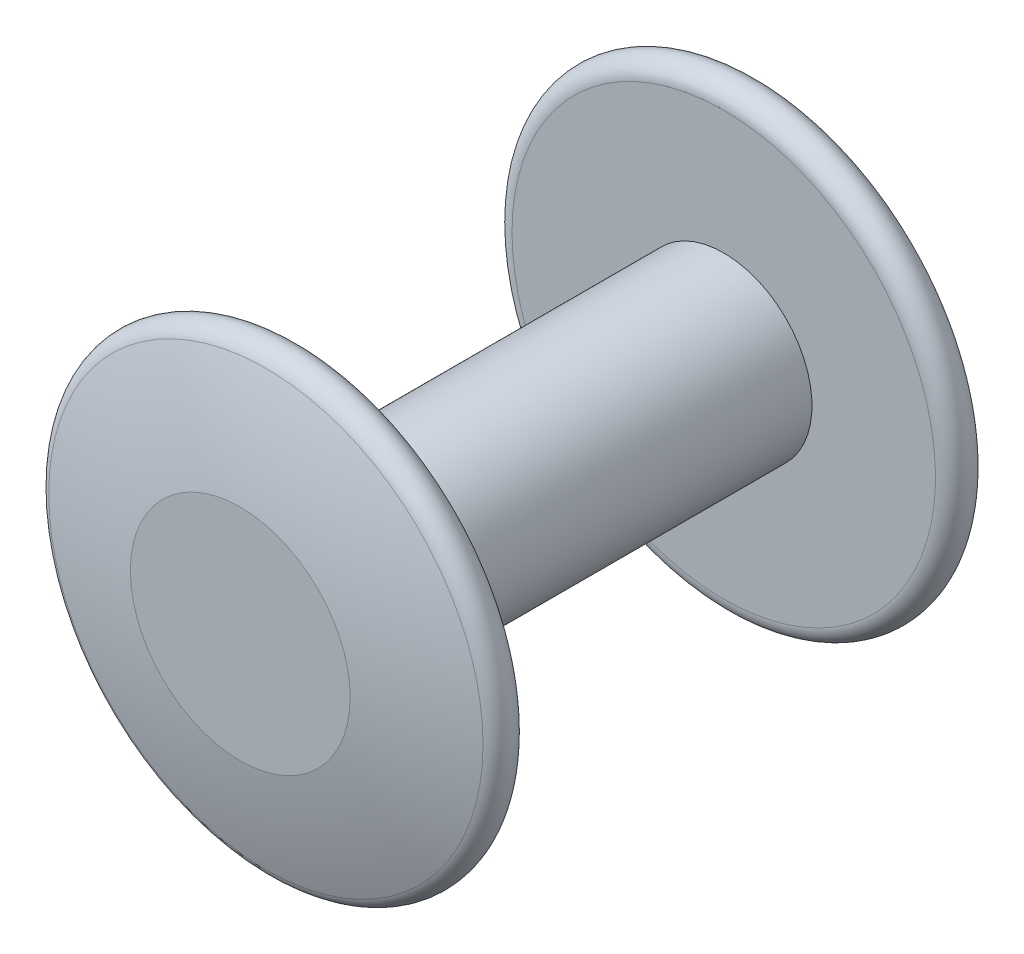
ISO-10303-21;
HEADER;
FILE_DESCRIPTION(('STEP AP214'),'2;1');
FILE_NAME('part.step','',(''),(''),'','','');
FILE_SCHEMA(('AUTOMOTIVE_DESIGN { 1 0 10303 214 1 1 1 1 }'));
ENDSEC;
DATA;
#1=APPLICATION_CONTEXT('core data for automotive mechanical design processes');
#2=APPLICATION_PROTOCOL_DEFINITION('international standard','automotive_design',2000,#1);
#3=PRODUCT_CONTEXT('',#1,'mechanical');
#4=PRODUCT('Part','Part','',(#3));
#5=PRODUCT_RELATED_PRODUCT_CATEGORY('part','',(#4));
#6=PRODUCT_DEFINITION_FORMATION('','',#4);
#7=PRODUCT_DEFINITION_CONTEXT('part definition',#1,'design');
#8=PRODUCT_DEFINITION('design','',#6,#7);
#9=PRODUCT_DEFINITION_SHAPE('','',#8);
#10=(LENGTH_UNIT() NAMED_UNIT(*) SI_UNIT(.MILLI.,.METRE.));
#11=(NAMED_UNIT(*) PLANE_ANGLE_UNIT() SI_UNIT($,.RADIAN.));
#12=(NAMED_UNIT(*) SI_UNIT($,.STERADIAN.) SOLID_ANGLE_UNIT());
#13=UNCERTAINTY_MEASURE_WITH_UNIT(LENGTH_MEASURE(1.E-05),#10,'distance_accuracy_value','');
#14=(GEOMETRIC_REPRESENTATION_CONTEXT(3) GLOBAL_UNCERTAINTY_ASSIGNED_CONTEXT((#13)) GLOBAL_UNIT_ASSIGNED_CONTEXT((#10,
#11,#12)) REPRESENTATION_CONTEXT('',''));
#15=CARTESIAN_POINT('',(0.,0.,0.));
#16=DIRECTION('',(0.,0.,1.));
#17=DIRECTION('',(1.,0.,0.));
#18=AXIS2_PLACEMENT_3D('',#15,#16,#17);
#19=CARTESIAN_POINT('',(0.,0.,-12.0539753152795));
#20=DIRECTION('',(0.,0.,-1.));
#21=DIRECTION('',(1.,0.,0.));
#22=AXIS2_PLACEMENT_3D('',#19,#20,#21);
#23=SPHERICAL_SURFACE('',#22,20.);
#24=CARTESIAN_POINT('',(0.,0.,7.70196512603628));
#25=DIRECTION('',(0.,0.,-1.));
#26=DIRECTION('',(-1.,0.,0.));
#27=AXIS2_PLACEMENT_3D('',#24,#25,#26);
#28=CIRCLE('',#27,3.11493455455891);
#29=CARTESIAN_POINT('',(3.11493455455889,0.,7.70196512603628));
#30=VERTEX_POINT('',#29);
#31=EDGE_CURVE('E10',#30,#30,#28,.T.);
#32=CARTESIAN_POINT('',(0.,0.,6.97574295680203));
#33=DIRECTION('',(0.,0.,-1.));
#34=DIRECTION('',(-1.,0.,0.));
#35=AXIS2_PLACEMENT_3D('',#32,#33,#34);
#36=CIRCLE('',#35,6.15384615384618);
#37=CARTESIAN_POINT('',(6.15384615384621,0.,6.97574295680203));
#38=VERTEX_POINT('',#37);
#39=EDGE_CURVE('E59',#38,#38,#36,.T.);
#40=CARTESIAN_POINT('',(3.11493455455889,0.,7.70196512603628));
#41=CARTESIAN_POINT('',(3.14711685014083,0.,7.69689091905556));
#42=CARTESIAN_POINT('',(3.17928674673247,0.,7.69173807363344));
#43=CARTESIAN_POINT('',(3.24360097411827,0.,7.68127523192936));
#44=CARTESIAN_POINT('',(3.27574530491243,0.,7.67596523564741));
#45=CARTESIAN_POINT('',(3.34000763288644,0.,7.66518821824666));
#46=CARTESIAN_POINT('',(3.37212563006628,0.,7.65972119712786));
#47=CARTESIAN_POINT('',(3.43633452378729,0.,7.64863026083222));
#48=CARTESIAN_POINT('',(3.46842542032847,0.,7.64300634565538));
#49=CARTESIAN_POINT('',(3.53257934635121,0.,7.63160175550001));
#50=CARTESIAN_POINT('',(3.56464237583278,0.,7.62582108052149));
#51=CARTESIAN_POINT('',(3.62873980199265,0.,7.61410310883513));
#52=CARTESIAN_POINT('',(3.66077419867094,0.,7.60816581212729));
#53=CARTESIAN_POINT('',(3.72481359416128,0.,7.59613473877587));
#54=CARTESIAN_POINT('',(3.75681859297333,0.,7.59004096213229));
#55=CARTESIAN_POINT('',(3.82079842837111,0.,7.57769707444524));
#56=CARTESIAN_POINT('',(3.85277326495685,0.,7.57144696340178));
#57=CARTESIAN_POINT('',(3.9166920122621,0.,7.55879055618314));
#58=CARTESIAN_POINT('',(3.94863592298161,0.,7.55238426000795));
#59=CARTESIAN_POINT('',(4.01249205565314,0.,7.53941563552447));
#60=CARTESIAN_POINT('',(4.04440427760515,0.,7.53285330721617));
#61=CARTESIAN_POINT('',(4.10819627059719,0.,7.51957277519142));
#62=CARTESIAN_POINT('',(4.14007604163722,0.,7.51285457147497));
#63=CARTESIAN_POINT('',(4.20380237143583,0.,7.4992624490816));
#64=CARTESIAN_POINT('',(4.2356489301944,0.,7.49238853040468));
#65=CARTESIAN_POINT('',(4.29930807485383,0.,7.4784851422569));
#66=CARTESIAN_POINT('',(4.33112066075467,0.,7.47145567278605));
#67=CARTESIAN_POINT('',(4.39471109993372,0.,7.45724135093191));
#68=CARTESIAN_POINT('',(4.42648895321192,0.,7.45005649854862));
#69=CARTESIAN_POINT('',(4.49000916821025,0.,7.43553158246202));
#70=CARTESIAN_POINT('',(4.52175152993038,0.,7.42819151875872));
#71=CARTESIAN_POINT('',(4.5852000037248,0.,7.41335635533136));
#72=CARTESIAN_POINT('',(4.61690611579908,0.,7.40586125560731));
#73=CARTESIAN_POINT('',(4.68028133307973,0.,7.39071619914037));
#74=CARTESIAN_POINT('',(4.71195043828611,0.,7.38306624239748));
#75=CARTESIAN_POINT('',(4.77525088549271,0.,7.36761165459316));
#76=CARTESIAN_POINT('',(4.80688222749294,0.,7.35980702353173));
#77=CARTESIAN_POINT('',(4.87010639285089,0.,7.34404327348464));
#78=CARTESIAN_POINT('',(4.90169921620862,0.,7.33608415449898));
#79=CARTESIAN_POINT('',(4.96484558976513,0.,7.3200116186873));
#80=CARTESIAN_POINT('',(4.99639913996393,0.,7.31189820186127));
#81=CARTESIAN_POINT('',(5.05946621362408,0.,7.29551726413775));
#82=CARTESIAN_POINT('',(5.09097973708544,0.,7.28724974324024));
#83=CARTESIAN_POINT('',(5.15396600464818,0.,7.27056079482305));
#84=CARTESIAN_POINT('',(5.18543874874956,0.,7.26213936730336));
#85=CARTESIAN_POINT('',(5.2483427059437,0.,7.24514280676675));
#86=CARTESIAN_POINT('',(5.27977391903646,0.,7.23656767374983));
#87=CARTESIAN_POINT('',(5.3425940635566,0.,7.21926390701462));
#88=CARTESIAN_POINT('',(5.37398299498397,0.,7.21053527329633));
#89=CARTESIAN_POINT('',(5.43671782652633,0.,7.19292471362014));
#90=CARTESIAN_POINT('',(5.46806372664131,0.,7.18404278766222));
#91=CARTESIAN_POINT('',(5.53071174693969,0.,7.16612585562989));
#92=CARTESIAN_POINT('',(5.56201386712309,0.,7.15709084955547));
#93=CARTESIAN_POINT('',(5.62457357998426,0.,7.13886797306784));
#94=CARTESIAN_POINT('',(5.65583117266203,0.,7.12968010265462));
#95=CARTESIAN_POINT('',(5.71830108400292,0.,7.11115171692291));
#96=CARTESIAN_POINT('',(5.74951340266604,0.,7.1018112016044));
#97=CARTESIAN_POINT('',(5.81189202054391,0.,7.08297774912247));
#98=CARTESIAN_POINT('',(5.84305831975868,0.,7.07348481195904));
#99=CARTESIAN_POINT('',(5.90534415442736,0.,7.05434674255756));
#100=CARTESIAN_POINT('',(5.93646368988129,0.,7.04470161031952));
#101=CARTESIAN_POINT('',(5.99865525374993,0.,7.02525938091374));
#102=CARTESIAN_POINT('',(6.02972728216465,0.,7.01546228374601));
#103=CARTESIAN_POINT('',(6.09182309011986,0.,6.99571635922608));
#104=CARTESIAN_POINT('',(6.12284686966035,0.,6.98576753187387));
#105=CARTESIAN_POINT('',(6.15384615384621,0.,6.97574295680203));
#106=B_SPLINE_CURVE_WITH_KNOTS('',3,(#40,#41,#42,#43,#44,#45,#46,#47,#48,#49,#50,#51,#52,#53,
#54,#55,#56,#57,#58,#59,#60,#61,#62,#63,#64,#65,#66,#67,#68,#69,#70,#71,#72,#73,#74,#75,#76,#77,
#78,#79,#80,#81,#82,#83,#84,#85,#86,#87,#88,#89,#90,#91,#92,#93,#94,#95,#96,#97,#98,#99,#100,
#101,#102,#103,#104,#105),.UNSPECIFIED.,.F.,.F.,(4,2,2,2,2,2,2,2,2,2,2,2,2,2,2,2,2,2,2,2,2,2,2,
2,2,2,2,2,2,2,2,2,4),(0.,0.097739503345377,0.195479006690758,0.293218510036134,
0.390958013381516,0.488697516726892,0.586437020072274,0.68417652341765,0.781916026763032,
0.879655530108409,0.977395033453785,1.07513453679917,1.17287404014454,1.27061354348992,
1.3683530468353,1.46609255018068,1.56383205352606,1.66157155687144,1.75931106021682,
1.85705056356219,1.95479006690757,2.05252957025295,2.15026907359833,2.24800857694371,
2.34574808028908,2.44348758363447,2.54122708697984,2.63896659032522,2.7367060936706,
2.83444559701598,2.93218510036136,3.02992460370674,3.12766410705212),.UNSPECIFIED.);
#107=EDGE_CURVE('BSEAM31',#30,#38,#106,.T.);
#108=ORIENTED_EDGE('',*,*,#31,.T.);
#109=ORIENTED_EDGE('',*,*,#39,.F.);
#110=ORIENTED_EDGE('',*,*,#107,.T.);
#111=ORIENTED_EDGE('',*,*,#107,.F.);
#112=EDGE_LOOP('',(#108,#110,#109,#111));
#113=FACE_BOUND('',#112,.T.);
#114=ADVANCED_FACE('F31',(#113),#23,.T.);
#115=CARTESIAN_POINT('',(3.11493455455891,0.,7.70196512603628));
#116=DIRECTION('',(0.,0.,1.));
#117=DIRECTION('',(1.,0.,0.));
#118=AXIS2_PLACEMENT_3D('',#115,#116,#117);
#119=PLANE('',#118);
#120=ORIENTED_EDGE('',*,*,#31,.F.);
#121=EDGE_LOOP('',(#120));
#122=FACE_BOUND('',#121,.T.);
#123=ADVANCED_FACE('F67',(#122),#119,.T.);
#124=CARTESIAN_POINT('',(0.,0.,-7.70196512603628));
#125=DIRECTION('',(0.,0.,-1.));
#126=DIRECTION('',(-1.,0.,0.));
#127=AXIS2_PLACEMENT_3D('',#124,#125,#126);
#128=PLANE('',#127);
#129=CARTESIAN_POINT('',(0.,0.,-7.70196512603628));
#130=DIRECTION('',(0.,0.,-1.));
#131=DIRECTION('',(-1.,0.,0.));
#132=AXIS2_PLACEMENT_3D('',#129,#130,#131);
#133=CIRCLE('',#132,3.11493455455892);
#134=CARTESIAN_POINT('',(3.11493455455893,0.,-7.70196512603628));
#135=VERTEX_POINT('',#134);
#136=EDGE_CURVE('E37',#135,#135,#133,.T.);
#137=ORIENTED_EDGE('',*,*,#136,.T.);
#138=EDGE_LOOP('',(#137));
#139=FACE_BOUND('',#138,.T.);
#140=ADVANCED_FACE('F71',(#139),#128,.T.);
#141=CARTESIAN_POINT('',(0.,0.,12.0539753152795));
#142=DIRECTION('',(0.,0.,-1.));
#143=DIRECTION('',(1.,0.,0.));
#144=AXIS2_PLACEMENT_3D('',#141,#142,#143);
#145=SPHERICAL_SURFACE('',#144,20.);
#146=CARTESIAN_POINT('',(0.,0.,-6.97574295680205));
#147=DIRECTION('',(0.,0.,-1.));
#148=DIRECTION('',(-1.,0.,0.));
#149=AXIS2_PLACEMENT_3D('',#146,#147,#148);
#150=CIRCLE('',#149,6.15384615384616);
#151=CARTESIAN_POINT('',(6.15384615384616,0.,-6.97574295680205));
#152=VERTEX_POINT('',#151);
#153=EDGE_CURVE('E41',#152,#152,#150,.T.);
#154=CARTESIAN_POINT('',(6.15384615384616,0.,-6.97574295680205));
#155=CARTESIAN_POINT('',(6.1228468696603,0.,-6.98576753187389));
#156=CARTESIAN_POINT('',(6.09182309011981,0.,-6.99571635922609));
#157=CARTESIAN_POINT('',(6.0297272821646,0.,-7.01546228374603));
#158=CARTESIAN_POINT('',(5.99865525374988,0.,-7.02525938091376));
#159=CARTESIAN_POINT('',(5.93646368988124,0.,-7.04470161031953));
#160=CARTESIAN_POINT('',(5.90534415442732,0.,-7.05434674255758));
#161=CARTESIAN_POINT('',(5.84305831975864,0.,-7.07348481195905));
#162=CARTESIAN_POINT('',(5.81189202054387,0.,-7.08297774912248));
#163=CARTESIAN_POINT('',(5.749513402666,0.,-7.10181120160441));
#164=CARTESIAN_POINT('',(5.71830108400288,0.,-7.11115171692292));
#165=CARTESIAN_POINT('',(5.65583117266199,0.,-7.12968010265464));
#166=CARTESIAN_POINT('',(5.62457357998422,0.,-7.13886797306785));
#167=CARTESIAN_POINT('',(5.56201386712306,0.,-7.15709084955549));
#168=CARTESIAN_POINT('',(5.53071174693966,0.,-7.1661258556299));
#169=CARTESIAN_POINT('',(5.46806372664128,0.,-7.18404278766223));
#170=CARTESIAN_POINT('',(5.4367178265263,0.,-7.19292471362014));
#171=CARTESIAN_POINT('',(5.37398299498394,0.,-7.21053527329635));
#172=CARTESIAN_POINT('',(5.34259406355657,0.,-7.21926390701463));
#173=CARTESIAN_POINT('',(5.27977391903644,0.,-7.23656767374984));
#174=CARTESIAN_POINT('',(5.24834270594368,0.,-7.24514280676676));
#175=CARTESIAN_POINT('',(5.18543874874954,0.,-7.26213936730337));
#176=CARTESIAN_POINT('',(5.15396600464816,0.,-7.27056079482306));
#177=CARTESIAN_POINT('',(5.09097973708542,0.,-7.28724974324025));
#178=CARTESIAN_POINT('',(5.05946621362406,0.,-7.29551726413775));
#179=CARTESIAN_POINT('',(4.99639913996391,0.,-7.31189820186128));
#180=CARTESIAN_POINT('',(4.96484558976512,0.,-7.3200116186873));
#181=CARTESIAN_POINT('',(4.9016992162086,0.,-7.33608415449899));
#182=CARTESIAN_POINT('',(4.87010639285088,0.,-7.34404327348465));
#183=CARTESIAN_POINT('',(4.80688222749293,0.,-7.35980702353174));
#184=CARTESIAN_POINT('',(4.7752508854927,0.,-7.36761165459317));
#185=CARTESIAN_POINT('',(4.7119504382861,0.,-7.38306624239748));
#186=CARTESIAN_POINT('',(4.68028133307973,0.,-7.39071619914037));
#187=CARTESIAN_POINT('',(4.61690611579907,0.,-7.40586125560731));
#188=CARTESIAN_POINT('',(4.58520000372479,0.,-7.41335635533137));
#189=CARTESIAN_POINT('',(4.52175152993038,0.,-7.42819151875873));
#190=CARTESIAN_POINT('',(4.49000916821024,0.,-7.43553158246203));
#191=CARTESIAN_POINT('',(4.42648895321191,0.,-7.45005649854862));
#192=CARTESIAN_POINT('',(4.39471109993372,0.,-7.45724135093191));
#193=CARTESIAN_POINT('',(4.33112066075468,0.,-7.47145567278606));
#194=CARTESIAN_POINT('',(4.29930807485383,0.,-7.47848514225691));
#195=CARTESIAN_POINT('',(4.23564893019441,0.,-7.49238853040468));
#196=CARTESIAN_POINT('',(4.20380237143583,0.,-7.4992624490816));
#197=CARTESIAN_POINT('',(4.14007604163723,0.,-7.51285457147497));
#198=CARTESIAN_POINT('',(4.1081962705972,0.,-7.51957277519143));
#199=CARTESIAN_POINT('',(4.04440427760516,0.,-7.53285330721617));
#200=CARTESIAN_POINT('',(4.01249205565315,0.,-7.53941563552447));
#201=CARTESIAN_POINT('',(3.94863592298162,0.,-7.55238426000795));
#202=CARTESIAN_POINT('',(3.91669201226211,0.,-7.55879055618314));
#203=CARTESIAN_POINT('',(3.85277326495686,0.,-7.57144696340178));
#204=CARTESIAN_POINT('',(3.82079842837112,0.,-7.57769707444524));
#205=CARTESIAN_POINT('',(3.75681859297334,0.,-7.59004096213228));
#206=CARTESIAN_POINT('',(3.7248135941613,0.,-7.59613473877587));
#207=CARTESIAN_POINT('',(3.66077419867096,0.,-7.60816581212729));
#208=CARTESIAN_POINT('',(3.62873980199267,0.,-7.61410310883512));
#209=CARTESIAN_POINT('',(3.5646423758328,0.,-7.62582108052149));
#210=CARTESIAN_POINT('',(3.53257934635123,0.,-7.63160175550001));
#211=CARTESIAN_POINT('',(3.46842542032849,0.,-7.64300634565538));
#212=CARTESIAN_POINT('',(3.43633452378732,0.,-7.64863026083222));
#213=CARTESIAN_POINT('',(3.3721256300663,0.,-7.65972119712786));
#214=CARTESIAN_POINT('',(3.34000763288647,0.,-7.66518821824666));
#215=CARTESIAN_POINT('',(3.27574530491247,0.,-7.67596523564741));
#216=CARTESIAN_POINT('',(3.2436009741183,0.,-7.68127523192936));
#217=CARTESIAN_POINT('',(3.1792867467325,0.,-7.69173807363344));
#218=CARTESIAN_POINT('',(3.14711685014087,0.,-7.69689091905556));
#219=CARTESIAN_POINT('',(3.11493455455893,0.,-7.70196512603628));
#220=B_SPLINE_CURVE_WITH_KNOTS('',3,(#154,#155,#156,#157,#158,#159,#160,#161,#162,#163,#164,
#165,#166,#167,#168,#169,#170,#171,#172,#173,#174,#175,#176,#177,#178,#179,#180,#181,#182,#183,
#184,#185,#186,#187,#188,#189,#190,#191,#192,#193,#194,#195,#196,#197,#198,#199,#200,#201,#202,
#203,#204,#205,#206,#207,#208,#209,#210,#211,#212,#213,#214,#215,#216,#217,#218,#219),
.UNSPECIFIED.,.F.,.F.,(4,2,2,2,2,2,2,2,2,2,2,2,2,2,2,2,2,2,2,2,2,2,2,2,2,2,2,2,2,2,2,2,4),(0.,
0.0977395033453767,0.195479006690754,0.293218510036125,0.390958013381503,0.48869751672688,
0.586437020072257,0.684176523417633,0.781916026763006,0.879655530108383,0.977395033453759,
1.07513453679914,1.17287404014451,1.27061354348989,1.36835304683526,1.46609255018064,
1.56383205352601,1.66157155687139,1.75931106021677,1.85705056356214,1.95479006690752,
2.05252957025289,2.15026907359827,2.24800857694365,2.34574808028902,2.4434875836344,
2.54122708697977,2.63896659032515,2.73670609367053,2.8344455970159,2.93218510036128,
3.02992460370665,3.12766410705203),.UNSPECIFIED.);
#221=EDGE_CURVE('BSEAM76',#152,#135,#220,.T.);
#222=ORIENTED_EDGE('',*,*,#153,.T.);
#223=ORIENTED_EDGE('',*,*,#136,.F.);
#224=ORIENTED_EDGE('',*,*,#221,.T.);
#225=ORIENTED_EDGE('',*,*,#221,.F.);
#226=EDGE_LOOP('',(#222,#224,#223,#225));
#227=FACE_BOUND('',#226,.T.);
#228=ADVANCED_FACE('F76',(#227),#145,.T.);
#229=CARTESIAN_POINT('',(0.,0.,-6.5));
#230=DIRECTION('',(0.,0.,-1.));
#231=DIRECTION('',(-1.,0.,0.));
#232=AXIS2_PLACEMENT_3D('',#229,#230,#231);
#233=TOROIDAL_SURFACE('',#232,6.,0.500000000000001);
#234=CARTESIAN_POINT('',(0.,0.,-6.));
#235=DIRECTION('',(0.,0.,-1.));
#236=DIRECTION('',(-1.,0.,0.));
#237=AXIS2_PLACEMENT_3D('',#234,#235,#236);
#238=CIRCLE('',#237,6.);
#239=CARTESIAN_POINT('',(-6.,0.,-6.));
#240=VERTEX_POINT('',#239);
#241=EDGE_CURVE('E45',#240,#240,#238,.T.);
#242=ORIENTED_EDGE('',*,*,#241,.T.);
#243=EDGE_LOOP('',(#242));
#244=FACE_BOUND('',#243,.T.);
#245=ORIENTED_EDGE('',*,*,#153,.F.);
#246=EDGE_LOOP('',(#245));
#247=FACE_BOUND('',#246,.T.);
#248=ADVANCED_FACE('F81',(#244,#247),#233,.T.);
#249=CARTESIAN_POINT('',(6.,0.,-6.));
#250=DIRECTION('',(0.,0.,1.));
#251=DIRECTION('',(1.,0.,0.));
#252=AXIS2_PLACEMENT_3D('',#249,#250,#251);
#253=PLANE('',#252);
#254=CARTESIAN_POINT('',(0.,0.,-6.));
#255=DIRECTION('',(0.,0.,-1.));
#256=DIRECTION('',(-1.,0.,0.));
#257=AXIS2_PLACEMENT_3D('',#254,#255,#256);
#258=CIRCLE('',#257,2.5);
#259=CARTESIAN_POINT('',(-2.5,0.,-6.));
#260=VERTEX_POINT('',#259);
#261=EDGE_CURVE('E50',#260,#260,#258,.T.);
#262=ORIENTED_EDGE('',*,*,#261,.T.);
#263=EDGE_LOOP('',(#262));
#264=FACE_BOUND('',#263,.T.);
#265=ORIENTED_EDGE('',*,*,#241,.F.);
#266=EDGE_LOOP('',(#265));
#267=FACE_BOUND('',#266,.T.);
#268=ADVANCED_FACE('F85',(#264,#267),#253,.T.);
#269=CARTESIAN_POINT('',(0.,0.,7.70196512603628));
#270=DIRECTION('',(0.,0.,-1.));
#271=DIRECTION('',(-1.,0.,0.));
#272=AXIS2_PLACEMENT_3D('',#269,#270,#271);
#273=CYLINDRICAL_SURFACE('',#272,2.5);
#274=CARTESIAN_POINT('',(0.,0.,6.));
#275=DIRECTION('',(0.,0.,-1.));
#276=DIRECTION('',(-1.,0.,0.));
#277=AXIS2_PLACEMENT_3D('',#274,#275,#276);
#278=CIRCLE('',#277,2.5);
#279=CARTESIAN_POINT('',(-2.5,0.,6.));
#280=VERTEX_POINT('',#279);
#281=EDGE_CURVE('E53',#280,#280,#278,.T.);
#282=ORIENTED_EDGE('',*,*,#281,.T.);
#283=EDGE_LOOP('',(#282));
#284=FACE_BOUND('',#283,.T.);
#285=ORIENTED_EDGE('',*,*,#261,.F.);
#286=EDGE_LOOP('',(#285));
#287=FACE_BOUND('',#286,.T.);
#288=ADVANCED_FACE('F89',(#284,#287),#273,.T.);
#289=CARTESIAN_POINT('',(2.5,0.,6.));
#290=DIRECTION('',(0.,0.,-1.));
#291=DIRECTION('',(-1.,0.,0.));
#292=AXIS2_PLACEMENT_3D('',#289,#290,#291);
#293=PLANE('',#292);
#294=CARTESIAN_POINT('',(0.,0.,6.));
#295=DIRECTION('',(0.,0.,-1.));
#296=DIRECTION('',(-1.,0.,0.));
#297=AXIS2_PLACEMENT_3D('',#294,#295,#296);
#298=CIRCLE('',#297,6.);
#299=CARTESIAN_POINT('',(-6.,0.,6.));
#300=VERTEX_POINT('',#299);
#301=EDGE_CURVE('E56',#300,#300,#298,.T.);
#302=ORIENTED_EDGE('',*,*,#301,.T.);
#303=EDGE_LOOP('',(#302));
#304=FACE_BOUND('',#303,.T.);
#305=ORIENTED_EDGE('',*,*,#281,.F.);
#306=EDGE_LOOP('',(#305));
#307=FACE_BOUND('',#306,.T.);
#308=ADVANCED_FACE('F93',(#304,#307),#293,.T.);
#309=CARTESIAN_POINT('',(0.,0.,6.5));
#310=DIRECTION('',(0.,0.,-1.));
#311=DIRECTION('',(-1.,0.,0.));
#312=AXIS2_PLACEMENT_3D('',#309,#310,#311);
#313=TOROIDAL_SURFACE('',#312,6.,0.5);
#314=ORIENTED_EDGE('',*,*,#39,.T.);
#315=EDGE_LOOP('',(#314));
#316=FACE_BOUND('',#315,.T.);
#317=ORIENTED_EDGE('',*,*,#301,.F.);
#318=EDGE_LOOP('',(#317));
#319=FACE_BOUND('',#318,.T.);
#320=ADVANCED_FACE('F63',(#316,#319),#313,.T.);
#321=CLOSED_SHELL('',(#114,#123,#140,#228,#248,#268,#288,#308,#320));
#322=MANIFOLD_SOLID_BREP('B2',#321);
#323=ADVANCED_BREP_SHAPE_REPRESENTATION('',(#18,#322),#14);
#324=SHAPE_DEFINITION_REPRESENTATION(#9,#323);
ENDSEC;
END-ISO-10303-21;
